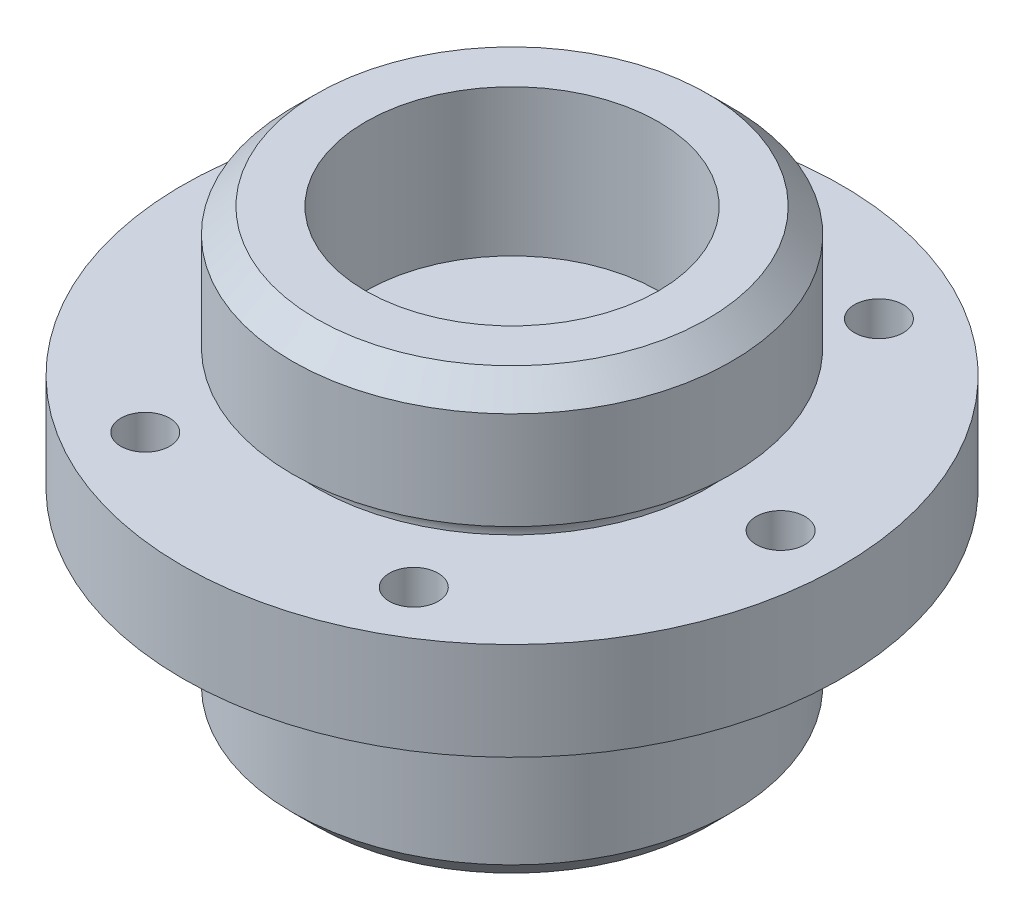
ISO-10303-21;
HEADER;
FILE_DESCRIPTION(('STEP AP214'),'2;1');
FILE_NAME('part.step','',(''),(''),'','','');
FILE_SCHEMA(('AUTOMOTIVE_DESIGN { 1 0 10303 214 1 1 1 1 }'));
ENDSEC;
DATA;
#1=APPLICATION_CONTEXT('core data for automotive mechanical design processes');
#2=APPLICATION_PROTOCOL_DEFINITION('international standard','automotive_design',2000,#1);
#3=PRODUCT_CONTEXT('',#1,'mechanical');
#4=PRODUCT('Part','Part','',(#3));
#5=PRODUCT_RELATED_PRODUCT_CATEGORY('part','',(#4));
#6=PRODUCT_DEFINITION_FORMATION('','',#4);
#7=PRODUCT_DEFINITION_CONTEXT('part definition',#1,'design');
#8=PRODUCT_DEFINITION('design','',#6,#7);
#9=PRODUCT_DEFINITION_SHAPE('','',#8);
#10=(LENGTH_UNIT() NAMED_UNIT(*) SI_UNIT(.MILLI.,.METRE.));
#11=(NAMED_UNIT(*) PLANE_ANGLE_UNIT() SI_UNIT($,.RADIAN.));
#12=(NAMED_UNIT(*) SI_UNIT($,.STERADIAN.) SOLID_ANGLE_UNIT());
#13=UNCERTAINTY_MEASURE_WITH_UNIT(LENGTH_MEASURE(1.E-05),#10,'distance_accuracy_value','');
#14=(GEOMETRIC_REPRESENTATION_CONTEXT(3) GLOBAL_UNCERTAINTY_ASSIGNED_CONTEXT((#13)) GLOBAL_UNIT_ASSIGNED_CONTEXT((#10,
#11,#12)) REPRESENTATION_CONTEXT('',''));
#15=CARTESIAN_POINT('',(0.,0.,0.));
#16=DIRECTION('',(0.,0.,1.));
#17=DIRECTION('',(1.,0.,0.));
#18=AXIS2_PLACEMENT_3D('',#15,#16,#17);
#19=CARTESIAN_POINT('',(0.,0.,0.));
#20=DIRECTION('',(0.,1.,0.));
#21=DIRECTION('',(0.,0.,1.));
#22=AXIS2_PLACEMENT_3D('',#19,#20,#21);
#23=PLANE('',#22);
#24=CARTESIAN_POINT('',(-43.9999999999984,0.,7.12143584374129E-13));
#25=DIRECTION('',(0.,1.,0.));
#26=DIRECTION('',(0.,0.,1.));
#27=AXIS2_PLACEMENT_3D('',#24,#25,#26);
#28=CIRCLE('',#27,4.00000000000108);
#29=CARTESIAN_POINT('',(-43.9999999999984,0.,4.00000000000179));
#30=VERTEX_POINT('',#29);
#31=EDGE_CURVE('E248',#30,#30,#28,.T.);
#32=ORIENTED_EDGE('',*,*,#31,.T.);
#33=EDGE_LOOP('',(#32));
#34=FACE_BOUND('',#33,.T.);
#35=CARTESIAN_POINT('',(-21.999999999997,0.,38.1051177665152));
#36=DIRECTION('',(0.,1.,0.));
#37=DIRECTION('',(0.,0.,1.));
#38=AXIS2_PLACEMENT_3D('',#35,#36,#37);
#39=CIRCLE('',#38,4.00000000000278);
#40=CARTESIAN_POINT('',(-21.999999999997,0.,42.105117766518));
#41=VERTEX_POINT('',#40);
#42=EDGE_CURVE('E242',#41,#41,#39,.T.);
#43=ORIENTED_EDGE('',*,*,#42,.T.);
#44=EDGE_LOOP('',(#43));
#45=FACE_BOUND('',#44,.T.);
#46=CARTESIAN_POINT('',(22.000000000003,0.,38.1051177665136));
#47=DIRECTION('',(0.,1.,0.));
#48=DIRECTION('',(0.,0.,1.));
#49=AXIS2_PLACEMENT_3D('',#46,#47,#48);
#50=CIRCLE('',#49,4.00000000000394);
#51=CARTESIAN_POINT('',(22.000000000003,0.,42.1051177665175));
#52=VERTEX_POINT('',#51);
#53=EDGE_CURVE('E236',#52,#52,#50,.T.);
#54=ORIENTED_EDGE('',*,*,#53,.T.);
#55=EDGE_LOOP('',(#54));
#56=FACE_BOUND('',#55,.T.);
#57=CARTESIAN_POINT('',(44.0000000000016,0.,-2.54054212805368E-12));
#58=DIRECTION('',(0.,1.,0.));
#59=DIRECTION('',(0.,0.,1.));
#60=AXIS2_PLACEMENT_3D('',#57,#58,#59);
#61=CIRCLE('',#60,4.00000000000329);
#62=CARTESIAN_POINT('',(44.0000000000016,0.,4.00000000000075));
#63=VERTEX_POINT('',#62);
#64=EDGE_CURVE('E227',#63,#63,#61,.T.);
#65=ORIENTED_EDGE('',*,*,#64,.T.);
#66=EDGE_LOOP('',(#65));
#67=FACE_BOUND('',#66,.T.);
#68=CARTESIAN_POINT('',(22.0000000000002,0.,-38.105117766517));
#69=DIRECTION('',(0.,1.,0.));
#70=DIRECTION('',(0.,0.,1.));
#71=AXIS2_PLACEMENT_3D('',#68,#69,#70);
#72=CIRCLE('',#71,4.00000000000138);
#73=CARTESIAN_POINT('',(22.0000000000002,0.,-34.1051177665156));
#74=VERTEX_POINT('',#73);
#75=EDGE_CURVE('E222',#74,#74,#72,.T.);
#76=ORIENTED_EDGE('',*,*,#75,.T.);
#77=EDGE_LOOP('',(#76));
#78=FACE_BOUND('',#77,.T.);
#79=CARTESIAN_POINT('',(-21.9999999999998,0.,-38.1051177665154));
#80=DIRECTION('',(0.,1.,0.));
#81=DIRECTION('',(0.,0.,1.));
#82=AXIS2_PLACEMENT_3D('',#79,#80,#81);
#83=CIRCLE('',#82,4.00000000000001);
#84=CARTESIAN_POINT('',(-21.9999999999998,0.,-34.1051177665154));
#85=VERTEX_POINT('',#84);
#86=EDGE_CURVE('E74',#85,#85,#83,.T.);
#87=ORIENTED_EDGE('',*,*,#86,.T.);
#88=EDGE_LOOP('',(#87));
#89=FACE_BOUND('',#88,.T.);
#90=CARTESIAN_POINT('',(0.,0.,0.));
#91=DIRECTION('',(0.,-1.,0.));
#92=DIRECTION('',(0.,0.,1.));
#93=AXIS2_PLACEMENT_3D('',#90,#91,#92);
#94=CIRCLE('',#93,32.);
#95=CARTESIAN_POINT('',(0.,0.,32.));
#96=VERTEX_POINT('',#95);
#97=EDGE_CURVE('E73',#96,#96,#94,.T.);
#98=ORIENTED_EDGE('',*,*,#97,.F.);
#99=EDGE_LOOP('',(#98));
#100=FACE_BOUND('',#99,.T.);
#101=CARTESIAN_POINT('',(0.,0.,0.));
#102=DIRECTION('',(0.,1.,0.));
#103=DIRECTION('',(0.,0.,1.));
#104=AXIS2_PLACEMENT_3D('',#101,#102,#103);
#105=CIRCLE('',#104,54.);
#106=CARTESIAN_POINT('',(0.,0.,54.));
#107=VERTEX_POINT('',#106);
#108=EDGE_CURVE('E92',#107,#107,#105,.T.);
#109=ORIENTED_EDGE('',*,*,#108,.F.);
#110=EDGE_LOOP('',(#109));
#111=FACE_BOUND('',#110,.T.);
#112=ADVANCED_FACE('F35',(#34,#45,#56,#67,#78,#89,#100,#111),#23,.F.);
#113=CARTESIAN_POINT('',(0.,16.,0.));
#114=DIRECTION('',(0.,1.,0.));
#115=DIRECTION('',(0.,0.,1.));
#116=AXIS2_PLACEMENT_3D('',#113,#114,#115);
#117=PLANE('',#116);
#118=CARTESIAN_POINT('',(-43.9999999999984,16.,7.12143584374129E-13));
#119=DIRECTION('',(0.,1.,0.));
#120=DIRECTION('',(0.,0.,1.));
#121=AXIS2_PLACEMENT_3D('',#118,#119,#120);
#122=CIRCLE('',#121,4.00000000000108);
#123=CARTESIAN_POINT('',(-43.9999999999984,16.,4.00000000000179));
#124=VERTEX_POINT('',#123);
#125=EDGE_CURVE('E250',#124,#124,#122,.T.);
#126=ORIENTED_EDGE('',*,*,#125,.F.);
#127=EDGE_LOOP('',(#126));
#128=FACE_BOUND('',#127,.T.);
#129=CARTESIAN_POINT('',(-21.999999999997,16.,38.1051177665152));
#130=DIRECTION('',(0.,1.,0.));
#131=DIRECTION('',(0.,0.,1.));
#132=AXIS2_PLACEMENT_3D('',#129,#130,#131);
#133=CIRCLE('',#132,4.00000000000278);
#134=CARTESIAN_POINT('',(-21.999999999997,16.,42.105117766518));
#135=VERTEX_POINT('',#134);
#136=EDGE_CURVE('E245',#135,#135,#133,.T.);
#137=ORIENTED_EDGE('',*,*,#136,.F.);
#138=EDGE_LOOP('',(#137));
#139=FACE_BOUND('',#138,.T.);
#140=CARTESIAN_POINT('',(22.000000000003,16.,38.1051177665136));
#141=DIRECTION('',(0.,1.,0.));
#142=DIRECTION('',(0.,0.,1.));
#143=AXIS2_PLACEMENT_3D('',#140,#141,#142);
#144=CIRCLE('',#143,4.00000000000394);
#145=CARTESIAN_POINT('',(22.000000000003,16.,42.1051177665175));
#146=VERTEX_POINT('',#145);
#147=EDGE_CURVE('E239',#146,#146,#144,.T.);
#148=ORIENTED_EDGE('',*,*,#147,.F.);
#149=EDGE_LOOP('',(#148));
#150=FACE_BOUND('',#149,.T.);
#151=CARTESIAN_POINT('',(44.0000000000016,16.,-2.54054212805368E-12));
#152=DIRECTION('',(0.,1.,0.));
#153=DIRECTION('',(0.,0.,1.));
#154=AXIS2_PLACEMENT_3D('',#151,#152,#153);
#155=CIRCLE('',#154,4.00000000000329);
#156=CARTESIAN_POINT('',(44.0000000000016,16.,4.00000000000075));
#157=VERTEX_POINT('',#156);
#158=EDGE_CURVE('E231',#157,#157,#155,.T.);
#159=ORIENTED_EDGE('',*,*,#158,.F.);
#160=EDGE_LOOP('',(#159));
#161=FACE_BOUND('',#160,.T.);
#162=CARTESIAN_POINT('',(22.0000000000002,16.,-38.105117766517));
#163=DIRECTION('',(0.,1.,0.));
#164=DIRECTION('',(0.,0.,1.));
#165=AXIS2_PLACEMENT_3D('',#162,#163,#164);
#166=CIRCLE('',#165,4.00000000000138);
#167=CARTESIAN_POINT('',(22.0000000000002,16.,-34.1051177665156));
#168=VERTEX_POINT('',#167);
#169=EDGE_CURVE('E225',#168,#168,#166,.T.);
#170=ORIENTED_EDGE('',*,*,#169,.F.);
#171=EDGE_LOOP('',(#170));
#172=FACE_BOUND('',#171,.T.);
#173=CARTESIAN_POINT('',(-21.9999999999998,16.,-38.1051177665154));
#174=DIRECTION('',(0.,1.,0.));
#175=DIRECTION('',(0.,0.,1.));
#176=AXIS2_PLACEMENT_3D('',#173,#174,#175);
#177=CIRCLE('',#176,4.00000000000001);
#178=CARTESIAN_POINT('',(-21.9999999999998,16.,-34.1051177665154));
#179=VERTEX_POINT('',#178);
#180=EDGE_CURVE('E77',#179,#179,#177,.T.);
#181=ORIENTED_EDGE('',*,*,#180,.F.);
#182=EDGE_LOOP('',(#181));
#183=FACE_BOUND('',#182,.T.);
#184=CARTESIAN_POINT('',(0.,16.,0.));
#185=DIRECTION('',(0.,-1.,0.));
#186=DIRECTION('',(0.,0.,1.));
#187=AXIS2_PLACEMENT_3D('',#184,#185,#186);
#188=CIRCLE('',#187,32.);
#189=CARTESIAN_POINT('',(0.,16.,32.));
#190=VERTEX_POINT('',#189);
#191=EDGE_CURVE('E84',#190,#190,#188,.T.);
#192=ORIENTED_EDGE('',*,*,#191,.T.);
#193=EDGE_LOOP('',(#192));
#194=FACE_BOUND('',#193,.T.);
#195=CARTESIAN_POINT('',(0.,16.,0.));
#196=DIRECTION('',(0.,1.,0.));
#197=DIRECTION('',(0.,0.,1.));
#198=AXIS2_PLACEMENT_3D('',#195,#196,#197);
#199=CIRCLE('',#198,54.);
#200=CARTESIAN_POINT('',(0.,16.,54.));
#201=VERTEX_POINT('',#200);
#202=EDGE_CURVE('E93',#201,#201,#199,.T.);
#203=ORIENTED_EDGE('',*,*,#202,.T.);
#204=EDGE_LOOP('',(#203));
#205=FACE_BOUND('',#204,.T.);
#206=ADVANCED_FACE('F121',(#128,#139,#150,#161,#172,#183,#194,#205),#117,.T.);
#207=CARTESIAN_POINT('',(0.,16.,0.));
#208=DIRECTION('',(0.,-1.,0.));
#209=DIRECTION('',(0.,0.,-1.));
#210=AXIS2_PLACEMENT_3D('',#207,#208,#209);
#211=CYLINDRICAL_SURFACE('',#210,54.);
#212=ORIENTED_EDGE('',*,*,#202,.F.);
#213=EDGE_LOOP('',(#212));
#214=FACE_BOUND('',#213,.T.);
#215=ORIENTED_EDGE('',*,*,#108,.T.);
#216=EDGE_LOOP('',(#215));
#217=FACE_BOUND('',#216,.T.);
#218=ADVANCED_FACE('F154',(#214,#217),#211,.T.);
#219=CARTESIAN_POINT('',(0.,16.,0.));
#220=DIRECTION('',(0.,-1.,0.));
#221=DIRECTION('',(0.,0.,-1.));
#222=AXIS2_PLACEMENT_3D('',#219,#220,#221);
#223=TOROIDAL_SURFACE('',#222,36.,4.);
#224=CARTESIAN_POINT('',(0.,16.,36.));
#225=DIRECTION('',(1.,0.,0.));
#226=DIRECTION('',(0.,0.,1.));
#227=AXIS2_PLACEMENT_3D('',#224,#225,#226);
#228=CIRCLE('',#227,4.);
#229=CARTESIAN_POINT('',(0.,20.,36.));
#230=VERTEX_POINT('',#229);
#231=EDGE_CURVE('E88',#190,#230,#228,.T.);
#232=ORIENTED_EDGE('',*,*,#231,.F.);
#233=ORIENTED_EDGE('',*,*,#191,.F.);
#234=ORIENTED_EDGE('',*,*,#231,.T.);
#235=CARTESIAN_POINT('',(0.,20.,0.));
#236=DIRECTION('',(0.,-1.,0.));
#237=DIRECTION('',(0.,0.,1.));
#238=AXIS2_PLACEMENT_3D('',#235,#236,#237);
#239=CIRCLE('',#238,36.);
#240=EDGE_CURVE('E87',#230,#230,#239,.T.);
#241=ORIENTED_EDGE('',*,*,#240,.T.);
#242=EDGE_LOOP('',(#232,#233,#234,#241));
#243=FACE_BOUND('',#242,.T.);
#244=ADVANCED_FACE('F126',(#243),#223,.F.);
#245=CARTESIAN_POINT('',(0.,16.,0.));
#246=DIRECTION('',(0.,1.,0.));
#247=DIRECTION('',(0.,0.,1.));
#248=AXIS2_PLACEMENT_3D('',#245,#246,#247);
#249=CIRCLE('',#248,24.);
#250=CARTESIAN_POINT('',(0.,16.,24.));
#251=VERTEX_POINT('',#250);
#252=EDGE_CURVE('E96',#251,#251,#249,.F.);
#253=ORIENTED_EDGE('',*,*,#252,.F.);
#254=EDGE_LOOP('',(#253));
#255=FACE_BOUND('',#254,.T.);
#256=ADVANCED_FACE('F157',(#255),#117,.T.);
#257=CARTESIAN_POINT('',(0.,-32.,0.));
#258=DIRECTION('',(0.,1.,0.));
#259=DIRECTION('',(0.,0.,1.));
#260=AXIS2_PLACEMENT_3D('',#257,#258,#259);
#261=CYLINDRICAL_SURFACE('',#260,24.);
#262=ORIENTED_EDGE('',*,*,#252,.T.);
#263=EDGE_LOOP('',(#262));
#264=FACE_BOUND('',#263,.T.);
#265=CARTESIAN_POINT('',(0.,40.,0.));
#266=DIRECTION('',(0.,1.,0.));
#267=DIRECTION('',(0.,0.,1.));
#268=AXIS2_PLACEMENT_3D('',#265,#266,#267);
#269=CIRCLE('',#268,24.);
#270=CARTESIAN_POINT('',(0.,40.,24.));
#271=VERTEX_POINT('',#270);
#272=EDGE_CURVE('E106',#271,#271,#269,.T.);
#273=ORIENTED_EDGE('',*,*,#272,.T.);
#274=EDGE_LOOP('',(#273));
#275=FACE_BOUND('',#274,.T.);
#276=ADVANCED_FACE('F169',(#264,#275),#261,.F.);
#277=CARTESIAN_POINT('',(0.,40.,0.));
#278=DIRECTION('',(0.,1.,0.));
#279=DIRECTION('',(0.,0.,1.));
#280=AXIS2_PLACEMENT_3D('',#277,#278,#279);
#281=PLANE('',#280);
#282=CARTESIAN_POINT('',(0.,40.,0.));
#283=DIRECTION('',(0.,1.,0.));
#284=DIRECTION('',(0.,0.,1.));
#285=AXIS2_PLACEMENT_3D('',#282,#283,#284);
#286=CIRCLE('',#285,32.);
#287=CARTESIAN_POINT('',(0.,40.,32.));
#288=VERTEX_POINT('',#287);
#289=EDGE_CURVE('E102',#288,#288,#286,.T.);
#290=ORIENTED_EDGE('',*,*,#289,.T.);
#291=EDGE_LOOP('',(#290));
#292=FACE_BOUND('',#291,.T.);
#293=ORIENTED_EDGE('',*,*,#272,.F.);
#294=EDGE_LOOP('',(#293));
#295=FACE_BOUND('',#294,.T.);
#296=ADVANCED_FACE('F141',(#292,#295),#281,.T.);
#297=CARTESIAN_POINT('',(0.,40.,0.));
#298=DIRECTION('',(0.,-1.,0.));
#299=DIRECTION('',(0.,0.,-1.));
#300=AXIS2_PLACEMENT_3D('',#297,#298,#299);
#301=CONICAL_SURFACE('',#300,32.,0.785398163397444);
#302=CARTESIAN_POINT('',(0.,36.,0.));
#303=DIRECTION('',(0.,1.,0.));
#304=DIRECTION('',(0.,0.,1.));
#305=AXIS2_PLACEMENT_3D('',#302,#303,#304);
#306=CIRCLE('',#305,36.);
#307=CARTESIAN_POINT('',(0.,36.,36.));
#308=VERTEX_POINT('',#307);
#309=EDGE_CURVE('E113',#308,#308,#306,.F.);
#310=ORIENTED_EDGE('',*,*,#309,.F.);
#311=EDGE_LOOP('',(#310));
#312=FACE_BOUND('',#311,.T.);
#313=ORIENTED_EDGE('',*,*,#289,.F.);
#314=EDGE_LOOP('',(#313));
#315=FACE_BOUND('',#314,.T.);
#316=ADVANCED_FACE('F131',(#312,#315),#301,.T.);
#317=CARTESIAN_POINT('',(0.,-32.,0.));
#318=DIRECTION('',(0.,1.,0.));
#319=DIRECTION('',(0.,0.,1.));
#320=AXIS2_PLACEMENT_3D('',#317,#318,#319);
#321=CYLINDRICAL_SURFACE('',#320,36.);
#322=ORIENTED_EDGE('',*,*,#309,.T.);
#323=EDGE_LOOP('',(#322));
#324=FACE_BOUND('',#323,.T.);
#325=ORIENTED_EDGE('',*,*,#240,.F.);
#326=EDGE_LOOP('',(#325));
#327=FACE_BOUND('',#326,.T.);
#328=ADVANCED_FACE('F129',(#324,#327),#321,.T.);
#329=CARTESIAN_POINT('',(0.,0.,0.));
#330=DIRECTION('',(0.,-1.,0.));
#331=DIRECTION('',(0.,0.,-1.));
#332=AXIS2_PLACEMENT_3D('',#329,#330,#331);
#333=TOROIDAL_SURFACE('',#332,36.,4.);
#334=CARTESIAN_POINT('',(0.,0.,36.));
#335=DIRECTION('',(1.,0.,0.));
#336=DIRECTION('',(0.,0.,-1.));
#337=AXIS2_PLACEMENT_3D('',#334,#335,#336);
#338=CIRCLE('',#337,4.);
#339=CARTESIAN_POINT('',(0.,-4.,36.));
#340=VERTEX_POINT('',#339);
#341=EDGE_CURVE('E71',#340,#96,#338,.T.);
#342=ORIENTED_EDGE('',*,*,#341,.F.);
#343=CARTESIAN_POINT('',(0.,-4.,0.));
#344=DIRECTION('',(0.,-1.,0.));
#345=DIRECTION('',(0.,0.,1.));
#346=AXIS2_PLACEMENT_3D('',#343,#344,#345);
#347=CIRCLE('',#346,36.);
#348=EDGE_CURVE('E53',#340,#340,#347,.T.);
#349=ORIENTED_EDGE('',*,*,#348,.F.);
#350=ORIENTED_EDGE('',*,*,#341,.T.);
#351=ORIENTED_EDGE('',*,*,#97,.T.);
#352=EDGE_LOOP('',(#342,#349,#350,#351));
#353=FACE_BOUND('',#352,.T.);
#354=ADVANCED_FACE('F72',(#353),#333,.F.);
#355=CARTESIAN_POINT('',(0.,0.,0.));
#356=DIRECTION('',(0.,1.,0.));
#357=DIRECTION('',(0.,0.,1.));
#358=AXIS2_PLACEMENT_3D('',#355,#356,#357);
#359=CIRCLE('',#358,24.);
#360=CARTESIAN_POINT('',(0.,0.,24.));
#361=VERTEX_POINT('',#360);
#362=EDGE_CURVE('E99',#361,#361,#359,.F.);
#363=ORIENTED_EDGE('',*,*,#362,.T.);
#364=EDGE_LOOP('',(#363));
#365=FACE_BOUND('',#364,.T.);
#366=ADVANCED_FACE('F139',(#365),#23,.F.);
#367=CARTESIAN_POINT('',(0.,-32.,0.));
#368=DIRECTION('',(0.,1.,0.));
#369=DIRECTION('',(0.,0.,1.));
#370=AXIS2_PLACEMENT_3D('',#367,#368,#369);
#371=CIRCLE('',#370,24.);
#372=CARTESIAN_POINT('',(0.,-32.,24.));
#373=VERTEX_POINT('',#372);
#374=EDGE_CURVE('E103',#373,#373,#371,.T.);
#375=ORIENTED_EDGE('',*,*,#374,.F.);
#376=EDGE_LOOP('',(#375));
#377=FACE_BOUND('',#376,.T.);
#378=ORIENTED_EDGE('',*,*,#362,.F.);
#379=EDGE_LOOP('',(#378));
#380=FACE_BOUND('',#379,.T.);
#381=ADVANCED_FACE('F162',(#377,#380),#261,.F.);
#382=CARTESIAN_POINT('',(0.,-32.,0.));
#383=DIRECTION('',(0.,1.,0.));
#384=DIRECTION('',(0.,0.,1.));
#385=AXIS2_PLACEMENT_3D('',#382,#383,#384);
#386=PLANE('',#385);
#387=CARTESIAN_POINT('',(0.,-32.,0.));
#388=DIRECTION('',(0.,1.,0.));
#389=DIRECTION('',(0.,0.,1.));
#390=AXIS2_PLACEMENT_3D('',#387,#388,#389);
#391=CIRCLE('',#390,32.);
#392=CARTESIAN_POINT('',(0.,-32.,32.));
#393=VERTEX_POINT('',#392);
#394=EDGE_CURVE('E11',#393,#393,#391,.F.);
#395=ORIENTED_EDGE('',*,*,#394,.T.);
#396=EDGE_LOOP('',(#395));
#397=FACE_BOUND('',#396,.T.);
#398=ORIENTED_EDGE('',*,*,#374,.T.);
#399=EDGE_LOOP('',(#398));
#400=FACE_BOUND('',#399,.T.);
#401=ADVANCED_FACE('F167',(#397,#400),#386,.F.);
#402=CARTESIAN_POINT('',(0.,-28.,0.));
#403=DIRECTION('',(0.,1.,0.));
#404=DIRECTION('',(0.,0.,1.));
#405=AXIS2_PLACEMENT_3D('',#402,#403,#404);
#406=CONICAL_SURFACE('',#405,36.,0.785398163397452);
#407=ORIENTED_EDGE('',*,*,#394,.F.);
#408=EDGE_LOOP('',(#407));
#409=FACE_BOUND('',#408,.T.);
#410=CARTESIAN_POINT('',(0.,-28.,0.));
#411=DIRECTION('',(0.,1.,0.));
#412=DIRECTION('',(0.,0.,1.));
#413=AXIS2_PLACEMENT_3D('',#410,#411,#412);
#414=CIRCLE('',#413,36.);
#415=CARTESIAN_POINT('',(0.,-28.,36.));
#416=VERTEX_POINT('',#415);
#417=EDGE_CURVE('E45',#416,#416,#414,.T.);
#418=ORIENTED_EDGE('',*,*,#417,.F.);
#419=EDGE_LOOP('',(#418));
#420=FACE_BOUND('',#419,.T.);
#421=ADVANCED_FACE('F38',(#409,#420),#406,.T.);
#422=ORIENTED_EDGE('',*,*,#417,.T.);
#423=EDGE_LOOP('',(#422));
#424=FACE_BOUND('',#423,.T.);
#425=ORIENTED_EDGE('',*,*,#348,.T.);
#426=EDGE_LOOP('',(#425));
#427=FACE_BOUND('',#426,.T.);
#428=ADVANCED_FACE('F134',(#424,#427),#321,.T.);
#429=CARTESIAN_POINT('',(-21.9999999999998,0.,-38.1051177665154));
#430=DIRECTION('',(0.,1.,0.));
#431=DIRECTION('',(0.,0.,1.));
#432=AXIS2_PLACEMENT_3D('',#429,#430,#431);
#433=CYLINDRICAL_SURFACE('',#432,4.00000000000001);
#434=ORIENTED_EDGE('',*,*,#86,.F.);
#435=EDGE_LOOP('',(#434));
#436=FACE_BOUND('',#435,.T.);
#437=ORIENTED_EDGE('',*,*,#180,.T.);
#438=EDGE_LOOP('',(#437));
#439=FACE_BOUND('',#438,.T.);
#440=ADVANCED_FACE('F146',(#436,#439),#433,.F.);
#441=CARTESIAN_POINT('',(22.0000000000002,0.,-38.105117766517));
#442=DIRECTION('',(0.,1.,0.));
#443=DIRECTION('',(0.,0.,1.));
#444=AXIS2_PLACEMENT_3D('',#441,#442,#443);
#445=CYLINDRICAL_SURFACE('',#444,4.00000000000138);
#446=ORIENTED_EDGE('',*,*,#75,.F.);
#447=EDGE_LOOP('',(#446));
#448=FACE_BOUND('',#447,.T.);
#449=ORIENTED_EDGE('',*,*,#169,.T.);
#450=EDGE_LOOP('',(#449));
#451=FACE_BOUND('',#450,.T.);
#452=ADVANCED_FACE('F197',(#448,#451),#445,.F.);
#453=CARTESIAN_POINT('',(44.0000000000016,0.,-2.54054212805368E-12));
#454=DIRECTION('',(0.,1.,0.));
#455=DIRECTION('',(0.,0.,1.));
#456=AXIS2_PLACEMENT_3D('',#453,#454,#455);
#457=CYLINDRICAL_SURFACE('',#456,4.00000000000329);
#458=ORIENTED_EDGE('',*,*,#64,.F.);
#459=EDGE_LOOP('',(#458));
#460=FACE_BOUND('',#459,.T.);
#461=ORIENTED_EDGE('',*,*,#158,.T.);
#462=EDGE_LOOP('',(#461));
#463=FACE_BOUND('',#462,.T.);
#464=ADVANCED_FACE('F210',(#460,#463),#457,.F.);
#465=CARTESIAN_POINT('',(22.000000000003,0.,38.1051177665136));
#466=DIRECTION('',(0.,1.,0.));
#467=DIRECTION('',(0.,0.,1.));
#468=AXIS2_PLACEMENT_3D('',#465,#466,#467);
#469=CYLINDRICAL_SURFACE('',#468,4.00000000000394);
#470=ORIENTED_EDGE('',*,*,#53,.F.);
#471=EDGE_LOOP('',(#470));
#472=FACE_BOUND('',#471,.T.);
#473=ORIENTED_EDGE('',*,*,#147,.T.);
#474=EDGE_LOOP('',(#473));
#475=FACE_BOUND('',#474,.T.);
#476=ADVANCED_FACE('F206',(#472,#475),#469,.F.);
#477=CARTESIAN_POINT('',(-21.999999999997,0.,38.1051177665152));
#478=DIRECTION('',(0.,1.,0.));
#479=DIRECTION('',(0.,0.,1.));
#480=AXIS2_PLACEMENT_3D('',#477,#478,#479);
#481=CYLINDRICAL_SURFACE('',#480,4.00000000000278);
#482=ORIENTED_EDGE('',*,*,#42,.F.);
#483=EDGE_LOOP('',(#482));
#484=FACE_BOUND('',#483,.T.);
#485=ORIENTED_EDGE('',*,*,#136,.T.);
#486=EDGE_LOOP('',(#485));
#487=FACE_BOUND('',#486,.T.);
#488=ADVANCED_FACE('F202',(#484,#487),#481,.F.);
#489=CARTESIAN_POINT('',(-43.9999999999984,0.,7.12143584374129E-13));
#490=DIRECTION('',(0.,1.,0.));
#491=DIRECTION('',(0.,0.,1.));
#492=AXIS2_PLACEMENT_3D('',#489,#490,#491);
#493=CYLINDRICAL_SURFACE('',#492,4.00000000000108);
#494=ORIENTED_EDGE('',*,*,#31,.F.);
#495=EDGE_LOOP('',(#494));
#496=FACE_BOUND('',#495,.T.);
#497=ORIENTED_EDGE('',*,*,#125,.T.);
#498=EDGE_LOOP('',(#497));
#499=FACE_BOUND('',#498,.T.);
#500=ADVANCED_FACE('F199',(#496,#499),#493,.F.);
#501=CLOSED_SHELL('',(#112,#206,#218,#244,#256,#276,#296,#316,#328,#354,#366,#381,#401,#421,
#428,#440,#452,#464,#476,#488,#500));
#502=MANIFOLD_SOLID_BREP('B2',#501);
#503=ADVANCED_BREP_SHAPE_REPRESENTATION('',(#18,#502),#14);
#504=SHAPE_DEFINITION_REPRESENTATION(#9,#503);
ENDSEC;
END-ISO-10303-21;
